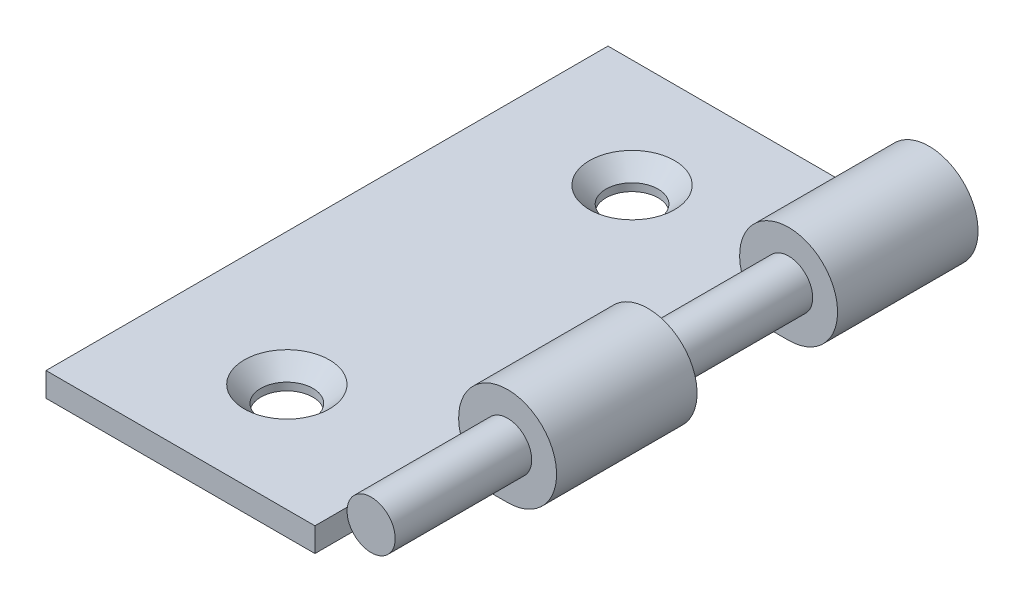
ISO-10303-21;
HEADER;
FILE_DESCRIPTION(('STEP AP214'),'2;1');
FILE_NAME('part.step','',(''),(''),'','','');
FILE_SCHEMA(('AUTOMOTIVE_DESIGN { 1 0 10303 214 1 1 1 1 }'));
ENDSEC;
DATA;
#1=APPLICATION_CONTEXT('core data for automotive mechanical design processes');
#2=APPLICATION_PROTOCOL_DEFINITION('international standard','automotive_design',2000,#1);
#3=PRODUCT_CONTEXT('',#1,'mechanical');
#4=PRODUCT('Part','Part','',(#3));
#5=PRODUCT_RELATED_PRODUCT_CATEGORY('part','',(#4));
#6=PRODUCT_DEFINITION_FORMATION('','',#4);
#7=PRODUCT_DEFINITION_CONTEXT('part definition',#1,'design');
#8=PRODUCT_DEFINITION('design','',#6,#7);
#9=PRODUCT_DEFINITION_SHAPE('','',#8);
#10=(LENGTH_UNIT() NAMED_UNIT(*) SI_UNIT(.MILLI.,.METRE.));
#11=(NAMED_UNIT(*) PLANE_ANGLE_UNIT() SI_UNIT($,.RADIAN.));
#12=(NAMED_UNIT(*) SI_UNIT($,.STERADIAN.) SOLID_ANGLE_UNIT());
#13=UNCERTAINTY_MEASURE_WITH_UNIT(LENGTH_MEASURE(1.E-05),#10,'distance_accuracy_value','');
#14=(GEOMETRIC_REPRESENTATION_CONTEXT(3) GLOBAL_UNCERTAINTY_ASSIGNED_CONTEXT((#13)) GLOBAL_UNIT_ASSIGNED_CONTEXT((#10,
#11,#12)) REPRESENTATION_CONTEXT('',''));
#15=CARTESIAN_POINT('',(0.,0.,0.));
#16=DIRECTION('',(0.,0.,1.));
#17=DIRECTION('',(1.,0.,0.));
#18=AXIS2_PLACEMENT_3D('',#15,#16,#17);
#19=CARTESIAN_POINT('',(-5.25357021462548,-3.1,70.));
#20=DIRECTION('',(0.,-1.,0.));
#21=DIRECTION('',(0.,0.,-1.));
#22=AXIS2_PLACEMENT_3D('',#19,#20,#21);
#23=PLANE('',#22);
#24=CARTESIAN_POINT('',(-23.5,-3.1,13.5));
#25=DIRECTION('',(0.,-1.,0.));
#26=DIRECTION('',(0.,0.,-1.));
#27=AXIS2_PLACEMENT_3D('',#24,#25,#26);
#28=CIRCLE('',#27,5.3);
#29=CARTESIAN_POINT('',(-23.5,-3.1,8.2));
#30=VERTEX_POINT('',#29);
#31=EDGE_CURVE('E10',#30,#30,#28,.T.);
#32=ORIENTED_EDGE('',*,*,#31,.T.);
#33=EDGE_LOOP('',(#32));
#34=FACE_BOUND('',#33,.T.);
#35=CARTESIAN_POINT('',(-23.5,-3.1,56.5));
#36=DIRECTION('',(0.,-1.,0.));
#37=DIRECTION('',(0.,0.,-1.));
#38=AXIS2_PLACEMENT_3D('',#35,#36,#37);
#39=CIRCLE('',#38,5.3);
#40=CARTESIAN_POINT('',(-23.5,-3.1,51.2));
#41=VERTEX_POINT('',#40);
#42=EDGE_CURVE('E27',#41,#41,#39,.T.);
#43=ORIENTED_EDGE('',*,*,#42,.T.);
#44=EDGE_LOOP('',(#43));
#45=FACE_BOUND('',#44,.T.);
#46=DIRECTION('',(-1.,0.,0.));
#47=VECTOR('',#46,1.);
#48=CARTESIAN_POINT('',(-5.25357021462548,-3.1,17.5));
#49=LINE('',#48,#47);
#50=CARTESIAN_POINT('',(-5.25357021462548,-3.1,17.5));
#51=VERTEX_POINT('',#50);
#52=CARTESIAN_POINT('',(-6.5,-3.1,17.5));
#53=VERTEX_POINT('',#52);
#54=EDGE_CURVE('E173',#51,#53,#49,.T.);
#55=ORIENTED_EDGE('',*,*,#54,.F.);
#56=DIRECTION('',(0.,0.,-1.));
#57=VECTOR('',#56,1.);
#58=CARTESIAN_POINT('',(-5.25357021462548,-3.1,70.));
#59=LINE('',#58,#57);
#60=CARTESIAN_POINT('',(-5.25357021462548,-3.1,0.));
#61=VERTEX_POINT('',#60);
#62=EDGE_CURVE('E204',#51,#61,#59,.T.);
#63=ORIENTED_EDGE('',*,*,#62,.T.);
#64=DIRECTION('',(-1.,0.,0.));
#65=VECTOR('',#64,1.);
#66=CARTESIAN_POINT('',(-5.25357021462548,-3.1,0.));
#67=LINE('',#66,#65);
#68=CARTESIAN_POINT('',(-40.,-3.1,0.));
#69=VERTEX_POINT('',#68);
#70=EDGE_CURVE('E208',#61,#69,#67,.T.);
#71=ORIENTED_EDGE('',*,*,#70,.T.);
#72=DIRECTION('',(0.,0.,-1.));
#73=VECTOR('',#72,1.);
#74=CARTESIAN_POINT('',(-40.,-3.1,70.));
#75=LINE('',#74,#73);
#76=CARTESIAN_POINT('',(-40.,-3.1,70.));
#77=VERTEX_POINT('',#76);
#78=EDGE_CURVE('E193',#77,#69,#75,.T.);
#79=ORIENTED_EDGE('',*,*,#78,.F.);
#80=DIRECTION('',(-1.,0.,0.));
#81=VECTOR('',#80,1.);
#82=CARTESIAN_POINT('',(-5.25357021462548,-3.1,70.));
#83=LINE('',#82,#81);
#84=CARTESIAN_POINT('',(-6.5,-3.1,70.));
#85=VERTEX_POINT('',#84);
#86=EDGE_CURVE('E255',#85,#77,#83,.T.);
#87=ORIENTED_EDGE('',*,*,#86,.F.);
#88=DIRECTION('',(0.,0.,1.));
#89=VECTOR('',#88,1.);
#90=CARTESIAN_POINT('',(-6.5,-3.1,70.));
#91=LINE('',#90,#89);
#92=CARTESIAN_POINT('',(-6.5,-3.1,52.5));
#93=VERTEX_POINT('',#92);
#94=EDGE_CURVE('E20',#93,#85,#91,.T.);
#95=ORIENTED_EDGE('',*,*,#94,.F.);
#96=DIRECTION('',(-1.,0.,0.));
#97=VECTOR('',#96,1.);
#98=CARTESIAN_POINT('',(-5.25357021462548,-3.1,52.5));
#99=LINE('',#98,#97);
#100=CARTESIAN_POINT('',(-5.25357021462548,-3.1,52.5));
#101=VERTEX_POINT('',#100);
#102=EDGE_CURVE('E216',#101,#93,#99,.T.);
#103=ORIENTED_EDGE('',*,*,#102,.F.);
#104=DIRECTION('',(0.,0.,-1.));
#105=VECTOR('',#104,1.);
#106=CARTESIAN_POINT('',(-5.25357021462548,-3.1,70.));
#107=LINE('',#106,#105);
#108=CARTESIAN_POINT('',(-5.25357021462548,-3.1,35.));
#109=VERTEX_POINT('',#108);
#110=EDGE_CURVE('E242',#101,#109,#107,.T.);
#111=ORIENTED_EDGE('',*,*,#110,.T.);
#112=DIRECTION('',(1.,0.,0.));
#113=VECTOR('',#112,1.);
#114=CARTESIAN_POINT('',(-5.25357021462548,-3.1,35.));
#115=LINE('',#114,#113);
#116=CARTESIAN_POINT('',(-6.5,-3.1,35.));
#117=VERTEX_POINT('',#116);
#118=EDGE_CURVE('E213',#117,#109,#115,.T.);
#119=ORIENTED_EDGE('',*,*,#118,.F.);
#120=DIRECTION('',(0.,0.,1.));
#121=VECTOR('',#120,1.);
#122=CARTESIAN_POINT('',(-6.5,-3.1,70.));
#123=LINE('',#122,#121);
#124=EDGE_CURVE('E178',#53,#117,#123,.T.);
#125=ORIENTED_EDGE('',*,*,#124,.F.);
#126=EDGE_LOOP('',(#55,#63,#71,#79,#87,#95,#103,#111,#119,#125));
#127=FACE_BOUND('',#126,.T.);
#128=ADVANCED_FACE('F16',(#34,#45,#127),#23,.F.);
#129=CARTESIAN_POINT('',(-40.,-6.1,70.));
#130=DIRECTION('',(0.,1.,0.));
#131=DIRECTION('',(1.,0.,0.));
#132=AXIS2_PLACEMENT_3D('',#129,#130,#131);
#133=PLANE('',#132);
#134=CARTESIAN_POINT('',(-23.5,-6.1,13.5));
#135=DIRECTION('',(0.,-1.,0.));
#136=DIRECTION('',(0.,0.,-1.));
#137=AXIS2_PLACEMENT_3D('',#134,#135,#136);
#138=CIRCLE('',#137,3.25);
#139=CARTESIAN_POINT('',(-23.5,-6.1,10.25));
#140=VERTEX_POINT('',#139);
#141=EDGE_CURVE('E326',#140,#140,#138,.T.);
#142=ORIENTED_EDGE('',*,*,#141,.F.);
#143=EDGE_LOOP('',(#142));
#144=FACE_BOUND('',#143,.T.);
#145=CARTESIAN_POINT('',(-23.5,-6.1,56.5));
#146=DIRECTION('',(0.,-1.,0.));
#147=DIRECTION('',(0.,0.,-1.));
#148=AXIS2_PLACEMENT_3D('',#145,#146,#147);
#149=CIRCLE('',#148,3.25);
#150=CARTESIAN_POINT('',(-23.5,-6.1,53.25));
#151=VERTEX_POINT('',#150);
#152=EDGE_CURVE('E203',#151,#151,#149,.T.);
#153=ORIENTED_EDGE('',*,*,#152,.F.);
#154=EDGE_LOOP('',(#153));
#155=FACE_BOUND('',#154,.T.);
#156=DIRECTION('',(1.,0.,0.));
#157=VECTOR('',#156,1.);
#158=CARTESIAN_POINT('',(-40.,-6.1,17.5));
#159=LINE('',#158,#157);
#160=CARTESIAN_POINT('',(-6.5,-6.1,17.5));
#161=VERTEX_POINT('',#160);
#162=CARTESIAN_POINT('',(0.,-6.1,17.5));
#163=VERTEX_POINT('',#162);
#164=EDGE_CURVE('E168',#161,#163,#159,.T.);
#165=ORIENTED_EDGE('',*,*,#164,.F.);
#166=DIRECTION('',(0.,0.,-1.));
#167=VECTOR('',#166,1.);
#168=CARTESIAN_POINT('',(-6.5,-6.1,70.));
#169=LINE('',#168,#167);
#170=CARTESIAN_POINT('',(-6.5,-6.1,35.));
#171=VERTEX_POINT('',#170);
#172=EDGE_CURVE('E164',#171,#161,#169,.T.);
#173=ORIENTED_EDGE('',*,*,#172,.F.);
#174=DIRECTION('',(-1.,0.,0.));
#175=VECTOR('',#174,1.);
#176=CARTESIAN_POINT('',(-40.,-6.1,35.));
#177=LINE('',#176,#175);
#178=CARTESIAN_POINT('',(0.,-6.1,35.));
#179=VERTEX_POINT('',#178);
#180=EDGE_CURVE('E150',#179,#171,#177,.T.);
#181=ORIENTED_EDGE('',*,*,#180,.F.);
#182=DIRECTION('',(0.,0.,-1.));
#183=VECTOR('',#182,1.);
#184=CARTESIAN_POINT('',(0.,-6.1,70.));
#185=LINE('',#184,#183);
#186=CARTESIAN_POINT('',(0.,-6.1,52.5));
#187=VERTEX_POINT('',#186);
#188=EDGE_CURVE('E354',#187,#179,#185,.T.);
#189=ORIENTED_EDGE('',*,*,#188,.F.);
#190=DIRECTION('',(1.,0.,0.));
#191=VECTOR('',#190,1.);
#192=CARTESIAN_POINT('',(-40.,-6.1,52.5));
#193=LINE('',#192,#191);
#194=CARTESIAN_POINT('',(-6.5,-6.1,52.5));
#195=VERTEX_POINT('',#194);
#196=EDGE_CURVE('E225',#195,#187,#193,.T.);
#197=ORIENTED_EDGE('',*,*,#196,.F.);
#198=DIRECTION('',(0.,0.,-1.));
#199=VECTOR('',#198,1.);
#200=CARTESIAN_POINT('',(-6.5,-6.1,70.));
#201=LINE('',#200,#199);
#202=CARTESIAN_POINT('',(-6.5,-6.1,70.));
#203=VERTEX_POINT('',#202);
#204=EDGE_CURVE('E220',#203,#195,#201,.T.);
#205=ORIENTED_EDGE('',*,*,#204,.F.);
#206=DIRECTION('',(1.,0.,0.));
#207=VECTOR('',#206,1.);
#208=CARTESIAN_POINT('',(-40.,-6.1,70.));
#209=LINE('',#208,#207);
#210=CARTESIAN_POINT('',(-40.,-6.1,70.));
#211=VERTEX_POINT('',#210);
#212=EDGE_CURVE('E346',#211,#203,#209,.T.);
#213=ORIENTED_EDGE('',*,*,#212,.F.);
#214=DIRECTION('',(0.,0.,-1.));
#215=VECTOR('',#214,1.);
#216=CARTESIAN_POINT('',(-40.,-6.1,70.));
#217=LINE('',#216,#215);
#218=CARTESIAN_POINT('',(-40.,-6.1,0.));
#219=VERTEX_POINT('',#218);
#220=EDGE_CURVE('E246',#211,#219,#217,.T.);
#221=ORIENTED_EDGE('',*,*,#220,.T.);
#222=DIRECTION('',(1.,0.,0.));
#223=VECTOR('',#222,1.);
#224=CARTESIAN_POINT('',(-40.,-6.1,0.));
#225=LINE('',#224,#223);
#226=CARTESIAN_POINT('',(0.,-6.1,0.));
#227=VERTEX_POINT('',#226);
#228=EDGE_CURVE('E263',#219,#227,#225,.T.);
#229=ORIENTED_EDGE('',*,*,#228,.T.);
#230=DIRECTION('',(0.,0.,-1.));
#231=VECTOR('',#230,1.);
#232=CARTESIAN_POINT('',(0.,-6.1,70.));
#233=LINE('',#232,#231);
#234=EDGE_CURVE('E261',#163,#227,#233,.T.);
#235=ORIENTED_EDGE('',*,*,#234,.F.);
#236=EDGE_LOOP('',(#165,#173,#181,#189,#197,#205,#213,#221,#229,#235));
#237=FACE_BOUND('',#236,.T.);
#238=ADVANCED_FACE('F165',(#144,#155,#237),#133,.F.);
#239=CARTESIAN_POINT('',(0.,0.,70.));
#240=DIRECTION('',(0.,0.,-1.));
#241=DIRECTION('',(-1.,0.,0.));
#242=AXIS2_PLACEMENT_3D('',#239,#240,#241);
#243=CYLINDRICAL_SURFACE('',#242,6.1);
#244=CARTESIAN_POINT('',(0.,0.,17.5));
#245=DIRECTION('',(0.,0.,1.));
#246=DIRECTION('',(1.,0.,0.));
#247=AXIS2_PLACEMENT_3D('',#244,#245,#246);
#248=CIRCLE('',#247,6.1);
#249=EDGE_CURVE('E209',#163,#51,#248,.T.);
#250=ORIENTED_EDGE('',*,*,#249,.F.);
#251=ORIENTED_EDGE('',*,*,#234,.T.);
#252=CARTESIAN_POINT('',(0.,0.,0.));
#253=DIRECTION('',(0.,0.,1.));
#254=DIRECTION('',(1.,0.,0.));
#255=AXIS2_PLACEMENT_3D('',#252,#253,#254);
#256=CIRCLE('',#255,6.1);
#257=EDGE_CURVE('E264',#227,#61,#256,.T.);
#258=ORIENTED_EDGE('',*,*,#257,.T.);
#259=ORIENTED_EDGE('',*,*,#62,.F.);
#260=EDGE_LOOP('',(#250,#251,#258,#259));
#261=FACE_BOUND('',#260,.T.);
#262=ADVANCED_FACE('F291',(#261),#243,.T.);
#263=CARTESIAN_POINT('',(0.,0.,70.));
#264=DIRECTION('',(0.,0.,-1.));
#265=DIRECTION('',(-1.,0.,0.));
#266=AXIS2_PLACEMENT_3D('',#263,#264,#265);
#267=CYLINDRICAL_SURFACE('',#266,6.1);
#268=CARTESIAN_POINT('',(0.,0.,35.));
#269=DIRECTION('',(0.,0.,-1.));
#270=DIRECTION('',(-1.,0.,0.));
#271=AXIS2_PLACEMENT_3D('',#268,#269,#270);
#272=CIRCLE('',#271,6.1);
#273=EDGE_CURVE('E156',#109,#179,#272,.T.);
#274=ORIENTED_EDGE('',*,*,#273,.F.);
#275=ORIENTED_EDGE('',*,*,#110,.F.);
#276=CARTESIAN_POINT('',(0.,0.,52.5));
#277=DIRECTION('',(0.,0.,1.));
#278=DIRECTION('',(1.,0.,0.));
#279=AXIS2_PLACEMENT_3D('',#276,#277,#278);
#280=CIRCLE('',#279,6.1);
#281=EDGE_CURVE('E184',#187,#101,#280,.T.);
#282=ORIENTED_EDGE('',*,*,#281,.F.);
#283=ORIENTED_EDGE('',*,*,#188,.T.);
#284=EDGE_LOOP('',(#274,#275,#282,#283));
#285=FACE_BOUND('',#284,.T.);
#286=ADVANCED_FACE('F382',(#285),#267,.T.);
#287=CARTESIAN_POINT('',(0.,0.,70.));
#288=DIRECTION('',(0.,0.,1.));
#289=DIRECTION('',(1.,0.,0.));
#290=AXIS2_PLACEMENT_3D('',#287,#288,#289);
#291=PLANE('',#290);
#292=ORIENTED_EDGE('',*,*,#212,.T.);
#293=DIRECTION('',(0.,1.,0.));
#294=VECTOR('',#293,1.);
#295=CARTESIAN_POINT('',(-6.5,0.,70.));
#296=LINE('',#295,#294);
#297=EDGE_CURVE('E258',#203,#85,#296,.T.);
#298=ORIENTED_EDGE('',*,*,#297,.T.);
#299=ORIENTED_EDGE('',*,*,#86,.T.);
#300=DIRECTION('',(0.,-1.,0.));
#301=VECTOR('',#300,1.);
#302=CARTESIAN_POINT('',(-40.,-3.1,70.));
#303=LINE('',#302,#301);
#304=EDGE_CURVE('E259',#77,#211,#303,.T.);
#305=ORIENTED_EDGE('',*,*,#304,.T.);
#306=EDGE_LOOP('',(#292,#298,#299,#305));
#307=FACE_BOUND('',#306,.T.);
#308=ADVANCED_FACE('F437',(#307),#291,.T.);
#309=CARTESIAN_POINT('',(-40.,-3.1,70.));
#310=DIRECTION('',(1.,0.,0.));
#311=DIRECTION('',(0.,1.,0.));
#312=AXIS2_PLACEMENT_3D('',#309,#310,#311);
#313=PLANE('',#312);
#314=DIRECTION('',(0.,-1.,0.));
#315=VECTOR('',#314,1.);
#316=CARTESIAN_POINT('',(-40.,-3.1,0.));
#317=LINE('',#316,#315);
#318=EDGE_CURVE('E254',#69,#219,#317,.T.);
#319=ORIENTED_EDGE('',*,*,#318,.T.);
#320=ORIENTED_EDGE('',*,*,#220,.F.);
#321=ORIENTED_EDGE('',*,*,#304,.F.);
#322=ORIENTED_EDGE('',*,*,#78,.T.);
#323=EDGE_LOOP('',(#319,#320,#321,#322));
#324=FACE_BOUND('',#323,.T.);
#325=ADVANCED_FACE('F440',(#324),#313,.F.);
#326=CARTESIAN_POINT('',(0.,0.,0.));
#327=DIRECTION('',(0.,0.,1.));
#328=DIRECTION('',(1.,0.,0.));
#329=AXIS2_PLACEMENT_3D('',#326,#327,#328);
#330=PLANE('',#329);
#331=CARTESIAN_POINT('',(0.,0.,0.));
#332=DIRECTION('',(0.,0.,1.));
#333=DIRECTION('',(1.,0.,0.));
#334=AXIS2_PLACEMENT_3D('',#331,#332,#333);
#335=CIRCLE('',#334,3.);
#336=CARTESIAN_POINT('',(3.,0.,0.));
#337=VERTEX_POINT('',#336);
#338=EDGE_CURVE('E189',#337,#337,#335,.T.);
#339=ORIENTED_EDGE('',*,*,#338,.T.);
#340=EDGE_LOOP('',(#339));
#341=FACE_BOUND('',#340,.T.);
#342=ORIENTED_EDGE('',*,*,#70,.F.);
#343=ORIENTED_EDGE('',*,*,#257,.F.);
#344=ORIENTED_EDGE('',*,*,#228,.F.);
#345=ORIENTED_EDGE('',*,*,#318,.F.);
#346=EDGE_LOOP('',(#342,#343,#344,#345));
#347=FACE_BOUND('',#346,.T.);
#348=ADVANCED_FACE('F297',(#341,#347),#330,.F.);
#349=CARTESIAN_POINT('',(-6.5,15.,52.5));
#350=DIRECTION('',(1.,0.,0.));
#351=DIRECTION('',(0.,1.,0.));
#352=AXIS2_PLACEMENT_3D('',#349,#350,#351);
#353=PLANE('',#352);
#354=ORIENTED_EDGE('',*,*,#94,.T.);
#355=ORIENTED_EDGE('',*,*,#297,.F.);
#356=ORIENTED_EDGE('',*,*,#204,.T.);
#357=DIRECTION('',(0.,-1.,0.));
#358=VECTOR('',#357,1.);
#359=CARTESIAN_POINT('',(-6.5,15.,52.5));
#360=LINE('',#359,#358);
#361=EDGE_CURVE('E221',#93,#195,#360,.T.);
#362=ORIENTED_EDGE('',*,*,#361,.F.);
#363=EDGE_LOOP('',(#354,#355,#356,#362));
#364=FACE_BOUND('',#363,.T.);
#365=ADVANCED_FACE('F434',(#364),#353,.T.);
#366=CARTESIAN_POINT('',(10.,15.,52.5));
#367=DIRECTION('',(0.,0.,1.));
#368=DIRECTION('',(1.,0.,0.));
#369=AXIS2_PLACEMENT_3D('',#366,#367,#368);
#370=PLANE('',#369);
#371=CARTESIAN_POINT('',(0.,0.,52.5));
#372=DIRECTION('',(0.,0.,1.));
#373=DIRECTION('',(1.,0.,0.));
#374=AXIS2_PLACEMENT_3D('',#371,#372,#373);
#375=CIRCLE('',#374,3.);
#376=CARTESIAN_POINT('',(3.,0.,52.5));
#377=VERTEX_POINT('',#376);
#378=EDGE_CURVE('E250',#377,#377,#375,.T.);
#379=ORIENTED_EDGE('',*,*,#378,.F.);
#380=EDGE_LOOP('',(#379));
#381=FACE_BOUND('',#380,.T.);
#382=ORIENTED_EDGE('',*,*,#102,.T.);
#383=ORIENTED_EDGE('',*,*,#361,.T.);
#384=ORIENTED_EDGE('',*,*,#196,.T.);
#385=ORIENTED_EDGE('',*,*,#281,.T.);
#386=EDGE_LOOP('',(#382,#383,#384,#385));
#387=FACE_BOUND('',#386,.T.);
#388=ADVANCED_FACE('F379',(#381,#387),#370,.T.);
#389=CARTESIAN_POINT('',(-6.5,15.,17.5));
#390=DIRECTION('',(1.,0.,0.));
#391=DIRECTION('',(0.,1.,0.));
#392=AXIS2_PLACEMENT_3D('',#389,#390,#391);
#393=PLANE('',#392);
#394=ORIENTED_EDGE('',*,*,#124,.T.);
#395=DIRECTION('',(0.,-1.,0.));
#396=VECTOR('',#395,1.);
#397=CARTESIAN_POINT('',(-6.5,15.,35.));
#398=LINE('',#397,#396);
#399=EDGE_CURVE('E154',#117,#171,#398,.T.);
#400=ORIENTED_EDGE('',*,*,#399,.T.);
#401=ORIENTED_EDGE('',*,*,#172,.T.);
#402=DIRECTION('',(0.,-1.,0.));
#403=VECTOR('',#402,1.);
#404=CARTESIAN_POINT('',(-6.5,15.,17.5));
#405=LINE('',#404,#403);
#406=EDGE_CURVE('E197',#53,#161,#405,.T.);
#407=ORIENTED_EDGE('',*,*,#406,.F.);
#408=EDGE_LOOP('',(#394,#400,#401,#407));
#409=FACE_BOUND('',#408,.T.);
#410=ADVANCED_FACE('F176',(#409),#393,.T.);
#411=CARTESIAN_POINT('',(24.7258064516129,15.,17.5));
#412=DIRECTION('',(0.,0.,1.));
#413=DIRECTION('',(1.,0.,0.));
#414=AXIS2_PLACEMENT_3D('',#411,#412,#413);
#415=PLANE('',#414);
#416=CARTESIAN_POINT('',(0.,0.,17.5));
#417=DIRECTION('',(0.,0.,1.));
#418=DIRECTION('',(1.,0.,0.));
#419=AXIS2_PLACEMENT_3D('',#416,#417,#418);
#420=CIRCLE('',#419,3.);
#421=CARTESIAN_POINT('',(3.,0.,17.5));
#422=VERTEX_POINT('',#421);
#423=EDGE_CURVE('E161',#422,#422,#420,.T.);
#424=ORIENTED_EDGE('',*,*,#423,.F.);
#425=EDGE_LOOP('',(#424));
#426=FACE_BOUND('',#425,.T.);
#427=ORIENTED_EDGE('',*,*,#54,.T.);
#428=ORIENTED_EDGE('',*,*,#406,.T.);
#429=ORIENTED_EDGE('',*,*,#164,.T.);
#430=ORIENTED_EDGE('',*,*,#249,.T.);
#431=EDGE_LOOP('',(#427,#428,#429,#430));
#432=FACE_BOUND('',#431,.T.);
#433=ADVANCED_FACE('F272',(#426,#432),#415,.T.);
#434=CARTESIAN_POINT('',(-6.5,15.,35.));
#435=DIRECTION('',(0.,0.,-1.));
#436=DIRECTION('',(0.,-1.,0.));
#437=AXIS2_PLACEMENT_3D('',#434,#435,#436);
#438=PLANE('',#437);
#439=CARTESIAN_POINT('',(0.,0.,35.));
#440=DIRECTION('',(0.,0.,-1.));
#441=DIRECTION('',(-1.,0.,0.));
#442=AXIS2_PLACEMENT_3D('',#439,#440,#441);
#443=CIRCLE('',#442,3.);
#444=CARTESIAN_POINT('',(-3.,0.,35.));
#445=VERTEX_POINT('',#444);
#446=EDGE_CURVE('E241',#445,#445,#443,.T.);
#447=ORIENTED_EDGE('',*,*,#446,.F.);
#448=EDGE_LOOP('',(#447));
#449=FACE_BOUND('',#448,.T.);
#450=ORIENTED_EDGE('',*,*,#118,.T.);
#451=ORIENTED_EDGE('',*,*,#273,.T.);
#452=ORIENTED_EDGE('',*,*,#180,.T.);
#453=ORIENTED_EDGE('',*,*,#399,.F.);
#454=EDGE_LOOP('',(#450,#451,#452,#453));
#455=FACE_BOUND('',#454,.T.);
#456=ADVANCED_FACE('F152',(#449,#455),#438,.T.);
#457=CARTESIAN_POINT('',(0.,0.,69.5));
#458=DIRECTION('',(0.,0.,-1.));
#459=DIRECTION('',(-1.,0.,0.));
#460=AXIS2_PLACEMENT_3D('',#457,#458,#459);
#461=CYLINDRICAL_SURFACE('',#460,3.);
#462=ORIENTED_EDGE('',*,*,#423,.T.);
#463=EDGE_LOOP('',(#462));
#464=FACE_BOUND('',#463,.T.);
#465=ORIENTED_EDGE('',*,*,#446,.T.);
#466=EDGE_LOOP('',(#465));
#467=FACE_BOUND('',#466,.T.);
#468=ADVANCED_FACE('F269',(#464,#467),#461,.T.);
#469=CARTESIAN_POINT('',(0.,0.,69.5));
#470=DIRECTION('',(0.,0.,1.));
#471=DIRECTION('',(1.,0.,0.));
#472=AXIS2_PLACEMENT_3D('',#469,#470,#471);
#473=PLANE('',#472);
#474=CARTESIAN_POINT('',(0.,0.,69.5));
#475=DIRECTION('',(0.,0.,1.));
#476=DIRECTION('',(1.,0.,0.));
#477=AXIS2_PLACEMENT_3D('',#474,#475,#476);
#478=CIRCLE('',#477,3.);
#479=CARTESIAN_POINT('',(3.,0.,69.5));
#480=VERTEX_POINT('',#479);
#481=EDGE_CURVE('E247',#480,#480,#478,.T.);
#482=ORIENTED_EDGE('',*,*,#481,.T.);
#483=EDGE_LOOP('',(#482));
#484=FACE_BOUND('',#483,.T.);
#485=ADVANCED_FACE('F279',(#484),#473,.T.);
#486=CARTESIAN_POINT('',(0.,0.,69.5));
#487=DIRECTION('',(0.,0.,-1.));
#488=DIRECTION('',(-1.,0.,0.));
#489=AXIS2_PLACEMENT_3D('',#486,#487,#488);
#490=CYLINDRICAL_SURFACE('',#489,3.);
#491=ORIENTED_EDGE('',*,*,#378,.T.);
#492=EDGE_LOOP('',(#491));
#493=FACE_BOUND('',#492,.T.);
#494=ORIENTED_EDGE('',*,*,#481,.F.);
#495=EDGE_LOOP('',(#494));
#496=FACE_BOUND('',#495,.T.);
#497=ADVANCED_FACE('F309',(#493,#496),#490,.T.);
#498=CARTESIAN_POINT('',(0.,0.,0.5));
#499=DIRECTION('',(0.,0.,-1.));
#500=DIRECTION('',(-1.,0.,0.));
#501=AXIS2_PLACEMENT_3D('',#498,#499,#500);
#502=CYLINDRICAL_SURFACE('',#501,3.);
#503=CARTESIAN_POINT('',(0.,0.,0.5));
#504=DIRECTION('',(0.,0.,1.));
#505=DIRECTION('',(1.,0.,0.));
#506=AXIS2_PLACEMENT_3D('',#503,#504,#505);
#507=CIRCLE('',#506,3.);
#508=CARTESIAN_POINT('',(3.,0.,0.5));
#509=VERTEX_POINT('',#508);
#510=EDGE_CURVE('E202',#509,#509,#507,.T.);
#511=ORIENTED_EDGE('',*,*,#510,.T.);
#512=EDGE_LOOP('',(#511));
#513=FACE_BOUND('',#512,.T.);
#514=ORIENTED_EDGE('',*,*,#338,.F.);
#515=EDGE_LOOP('',(#514));
#516=FACE_BOUND('',#515,.T.);
#517=ADVANCED_FACE('F307',(#513,#516),#502,.F.);
#518=CARTESIAN_POINT('',(0.,0.,0.5));
#519=DIRECTION('',(0.,0.,1.));
#520=DIRECTION('',(1.,0.,0.));
#521=AXIS2_PLACEMENT_3D('',#518,#519,#520);
#522=PLANE('',#521);
#523=ORIENTED_EDGE('',*,*,#510,.F.);
#524=EDGE_LOOP('',(#523));
#525=FACE_BOUND('',#524,.T.);
#526=ADVANCED_FACE('F304',(#525),#522,.F.);
#527=CARTESIAN_POINT('',(-23.5,-3.1,56.5));
#528=DIRECTION('',(0.,1.,0.));
#529=DIRECTION('',(0.,0.,1.));
#530=AXIS2_PLACEMENT_3D('',#527,#528,#529);
#531=CONICAL_SURFACE('',#530,5.3,0.785398163397448);
#532=CARTESIAN_POINT('',(-23.5,-5.15,56.5));
#533=DIRECTION('',(0.,-1.,0.));
#534=DIRECTION('',(0.,0.,-1.));
#535=AXIS2_PLACEMENT_3D('',#532,#533,#534);
#536=CIRCLE('',#535,3.25);
#537=CARTESIAN_POINT('',(-23.5,-5.15,53.25));
#538=VERTEX_POINT('',#537);
#539=EDGE_CURVE('E198',#538,#538,#536,.T.);
#540=ORIENTED_EDGE('',*,*,#539,.T.);
#541=EDGE_LOOP('',(#540));
#542=FACE_BOUND('',#541,.T.);
#543=ORIENTED_EDGE('',*,*,#42,.F.);
#544=EDGE_LOOP('',(#543));
#545=FACE_BOUND('',#544,.T.);
#546=ADVANCED_FACE('F18',(#542,#545),#531,.F.);
#547=CARTESIAN_POINT('',(-23.5,-6.1,56.5));
#548=DIRECTION('',(0.,-1.,0.));
#549=DIRECTION('',(0.,0.,-1.));
#550=AXIS2_PLACEMENT_3D('',#547,#548,#549);
#551=CYLINDRICAL_SURFACE('',#550,3.25);
#552=ORIENTED_EDGE('',*,*,#152,.T.);
#553=EDGE_LOOP('',(#552));
#554=FACE_BOUND('',#553,.T.);
#555=ORIENTED_EDGE('',*,*,#539,.F.);
#556=EDGE_LOOP('',(#555));
#557=FACE_BOUND('',#556,.T.);
#558=ADVANCED_FACE('F299',(#554,#557),#551,.F.);
#559=CARTESIAN_POINT('',(-23.5,-3.1,13.5));
#560=DIRECTION('',(0.,1.,0.));
#561=DIRECTION('',(0.,0.,1.));
#562=AXIS2_PLACEMENT_3D('',#559,#560,#561);
#563=CONICAL_SURFACE('',#562,5.3,0.785398163397448);
#564=CARTESIAN_POINT('',(-23.5,-5.15,13.5));
#565=DIRECTION('',(0.,-1.,0.));
#566=DIRECTION('',(0.,0.,-1.));
#567=AXIS2_PLACEMENT_3D('',#564,#565,#566);
#568=CIRCLE('',#567,3.25);
#569=CARTESIAN_POINT('',(-23.5,-5.15,10.25));
#570=VERTEX_POINT('',#569);
#571=EDGE_CURVE('E233',#570,#570,#568,.T.);
#572=ORIENTED_EDGE('',*,*,#571,.T.);
#573=EDGE_LOOP('',(#572));
#574=FACE_BOUND('',#573,.T.);
#575=ORIENTED_EDGE('',*,*,#31,.F.);
#576=EDGE_LOOP('',(#575));
#577=FACE_BOUND('',#576,.T.);
#578=ADVANCED_FACE('F302',(#574,#577),#563,.F.);
#579=CARTESIAN_POINT('',(-23.5,-6.1,13.5));
#580=DIRECTION('',(0.,-1.,0.));
#581=DIRECTION('',(0.,0.,-1.));
#582=AXIS2_PLACEMENT_3D('',#579,#580,#581);
#583=CYLINDRICAL_SURFACE('',#582,3.25);
#584=ORIENTED_EDGE('',*,*,#141,.T.);
#585=EDGE_LOOP('',(#584));
#586=FACE_BOUND('',#585,.T.);
#587=ORIENTED_EDGE('',*,*,#571,.F.);
#588=EDGE_LOOP('',(#587));
#589=FACE_BOUND('',#588,.T.);
#590=ADVANCED_FACE('F316',(#586,#589),#583,.F.);
#591=CLOSED_SHELL('',(#128,#238,#262,#286,#308,#325,#348,#365,#388,#410,#433,#456,#468,#485,
#497,#517,#526,#546,#558,#578,#590));
#592=MANIFOLD_SOLID_BREP('B1',#591);
#593=ADVANCED_BREP_SHAPE_REPRESENTATION('',(#18,#592),#14);
#594=SHAPE_DEFINITION_REPRESENTATION(#9,#593);
ENDSEC;
END-ISO-10303-21;
